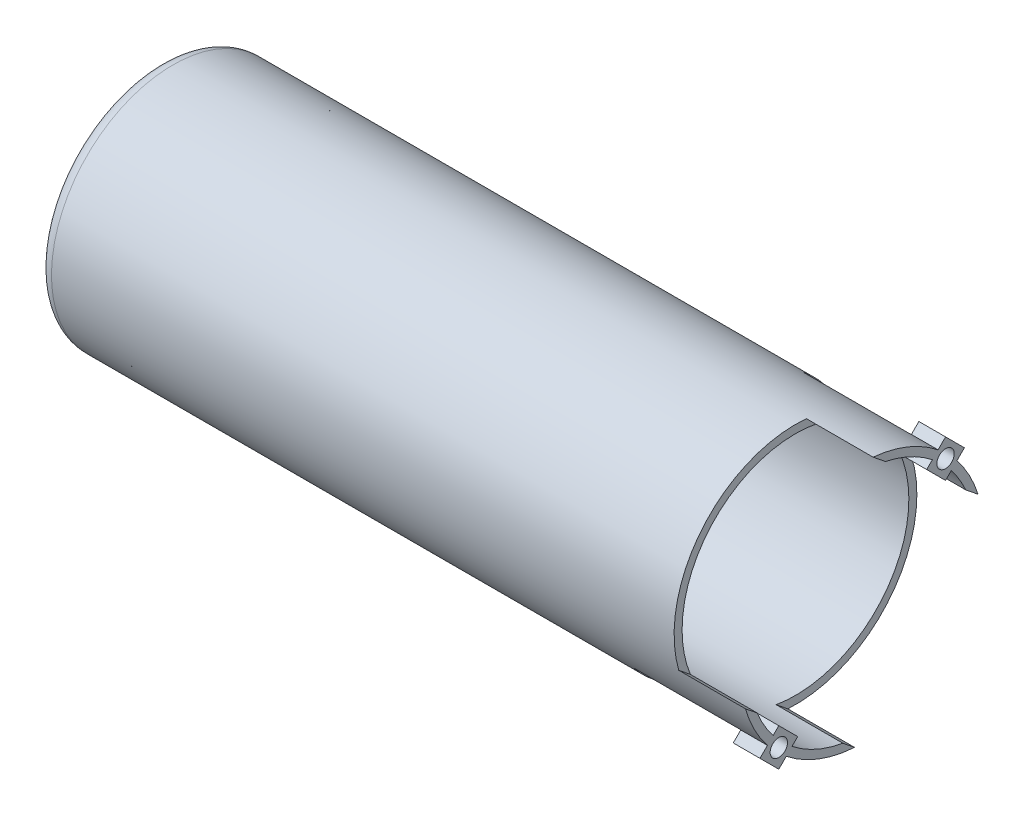
ISO-10303-21;
HEADER;
FILE_DESCRIPTION(('STEP AP214'),'2;1');
FILE_NAME('part.step','',(''),(''),'','','');
FILE_SCHEMA(('AUTOMOTIVE_DESIGN { 1 0 10303 214 1 1 1 1 }'));
ENDSEC;
DATA;
#1=APPLICATION_CONTEXT('core data for automotive mechanical design processes');
#2=APPLICATION_PROTOCOL_DEFINITION('international standard','automotive_design',2000,#1);
#3=PRODUCT_CONTEXT('',#1,'mechanical');
#4=PRODUCT('Part','Part','',(#3));
#5=PRODUCT_RELATED_PRODUCT_CATEGORY('part','',(#4));
#6=PRODUCT_DEFINITION_FORMATION('','',#4);
#7=PRODUCT_DEFINITION_CONTEXT('part definition',#1,'design');
#8=PRODUCT_DEFINITION('design','',#6,#7);
#9=PRODUCT_DEFINITION_SHAPE('','',#8);
#10=(LENGTH_UNIT() NAMED_UNIT(*) SI_UNIT(.MILLI.,.METRE.));
#11=(NAMED_UNIT(*) PLANE_ANGLE_UNIT() SI_UNIT($,.RADIAN.));
#12=(NAMED_UNIT(*) SI_UNIT($,.STERADIAN.) SOLID_ANGLE_UNIT());
#13=UNCERTAINTY_MEASURE_WITH_UNIT(LENGTH_MEASURE(1.E-05),#10,'distance_accuracy_value','');
#14=(GEOMETRIC_REPRESENTATION_CONTEXT(3) GLOBAL_UNCERTAINTY_ASSIGNED_CONTEXT((#13)) GLOBAL_UNIT_ASSIGNED_CONTEXT((#10,
#11,#12)) REPRESENTATION_CONTEXT('',''));
#15=CARTESIAN_POINT('',(0.,0.,0.));
#16=DIRECTION('',(0.,0.,1.));
#17=DIRECTION('',(1.,0.,0.));
#18=AXIS2_PLACEMENT_3D('',#15,#16,#17);
#19=CARTESIAN_POINT('',(-18.9272831798289,4.5526042800529,0.));
#20=DIRECTION('',(-1.,0.,0.));
#21=DIRECTION('',(0.,0.,1.));
#22=AXIS2_PLACEMENT_3D('',#19,#20,#21);
#23=CYLINDRICAL_SURFACE('',#22,8.5);
#24=CARTESIAN_POINT('',(-17.3259221439765,4.5526042800529,0.));
#25=DIRECTION('',(-1.,0.,0.));
#26=DIRECTION('',(0.,0.,1.));
#27=AXIS2_PLACEMENT_3D('',#24,#25,#26);
#28=CIRCLE('',#27,8.5);
#29=CARTESIAN_POINT('',(-17.3259221439765,4.5526042800529,8.5));
#30=VERTEX_POINT('',#29);
#31=EDGE_CURVE('E403',#30,#30,#28,.T.);
#32=ORIENTED_EDGE('',*,*,#31,.T.);
#33=EDGE_LOOP('',(#32));
#34=FACE_BOUND('',#33,.T.);
#35=DIRECTION('',(1.,0.,0.));
#36=VECTOR('',#35,1.);
#37=CARTESIAN_POINT('',(28.6740778560235,-2.13834676743719,5.2422489525099));
#38=LINE('',#37,#36);
#39=CARTESIAN_POINT('',(24.6740778560235,-2.13834676743719,5.2422489525099));
#40=VERTEX_POINT('',#39);
#41=CARTESIAN_POINT('',(32.6740778560235,-2.13834676743719,5.2422489525099));
#42=VERTEX_POINT('',#41);
#43=EDGE_CURVE('E272',#40,#42,#38,.T.);
#44=ORIENTED_EDGE('',*,*,#43,.T.);
#45=CARTESIAN_POINT('',(32.6740778560235,4.5526042800529,0.));
#46=DIRECTION('',(-1.,0.,0.));
#47=DIRECTION('',(0.,0.,1.));
#48=AXIS2_PLACEMENT_3D('',#45,#46,#47);
#49=CIRCLE('',#48,8.5);
#50=CARTESIAN_POINT('',(32.6740778560235,-2.12317069429031,5.26156141197011));
#51=VERTEX_POINT('',#50);
#52=EDGE_CURVE('E500',#42,#51,#49,.T.);
#53=ORIENTED_EDGE('',*,*,#52,.T.);
#54=DIRECTION('',(-1.,0.,0.));
#55=VECTOR('',#54,1.);
#56=CARTESIAN_POINT('',(-18.9272831798289,-2.12317069429031,5.26156141197011));
#57=LINE('',#56,#55);
#58=CARTESIAN_POINT('',(34.6740778560235,-2.12317069429031,5.26156141197011));
#59=VERTEX_POINT('',#58);
#60=EDGE_CURVE('E353',#59,#51,#57,.T.);
#61=ORIENTED_EDGE('',*,*,#60,.F.);
#62=CARTESIAN_POINT('',(34.6740778560235,4.5526042800529,0.));
#63=DIRECTION('',(-1.,0.,0.));
#64=DIRECTION('',(0.,0.,1.));
#65=AXIS2_PLACEMENT_3D('',#62,#63,#64);
#66=CIRCLE('',#65,8.5);
#67=CARTESIAN_POINT('',(34.6740778560235,-3.82289373435972,1.44949405330625));
#68=VERTEX_POINT('',#67);
#69=EDGE_CURVE('E405',#68,#59,#66,.T.);
#70=ORIENTED_EDGE('',*,*,#69,.F.);
#71=DIRECTION('',(-1.,0.,0.));
#72=VECTOR('',#71,1.);
#73=CARTESIAN_POINT('',(-18.9272831798289,-3.82289373435972,1.44949405330625));
#74=LINE('',#73,#72);
#75=CARTESIAN_POINT('',(29.6740778560235,-3.82289373435972,1.44949405330625));
#76=VERTEX_POINT('',#75);
#77=EDGE_CURVE('E381',#76,#68,#74,.F.);
#78=ORIENTED_EDGE('',*,*,#77,.F.);
#79=CARTESIAN_POINT('',(29.6740778560235,4.5526042800529,0.));
#80=DIRECTION('',(-1.,0.,0.));
#81=DIRECTION('',(0.,0.,1.));
#82=AXIS2_PLACEMENT_3D('',#79,#80,#81);
#83=CIRCLE('',#82,8.5);
#84=CARTESIAN_POINT('',(29.6740778560235,8.01924405990329,-7.76095410608508));
#85=VERTEX_POINT('',#84);
#86=EDGE_CURVE('E380',#85,#76,#83,.T.);
#87=ORIENTED_EDGE('',*,*,#86,.F.);
#88=DIRECTION('',(-1.,0.,0.));
#89=VECTOR('',#88,1.);
#90=CARTESIAN_POINT('',(-18.9272831798289,8.01924405990329,-7.76095410608508));
#91=LINE('',#90,#89);
#92=CARTESIAN_POINT('',(34.6740778560235,8.01924405990329,-7.76095410608508));
#93=VERTEX_POINT('',#92);
#94=EDGE_CURVE('E387',#93,#85,#91,.T.);
#95=ORIENTED_EDGE('',*,*,#94,.F.);
#96=CARTESIAN_POINT('',(34.6740778560235,9.81416569202302,-6.67577497434321));
#97=VERTEX_POINT('',#96);
#98=EDGE_CURVE('E404',#97,#93,#66,.T.);
#99=ORIENTED_EDGE('',*,*,#98,.F.);
#100=DIRECTION('',(-1.,0.,0.));
#101=VECTOR('',#100,1.);
#102=CARTESIAN_POINT('',(-18.9272831798289,9.81416569202302,-6.67577497434321));
#103=LINE('',#102,#101);
#104=CARTESIAN_POINT('',(32.6740778560235,9.81416569202302,-6.67577497434321));
#105=VERTEX_POINT('',#104);
#106=EDGE_CURVE('E317',#105,#97,#103,.F.);
#107=ORIENTED_EDGE('',*,*,#106,.F.);
#108=CARTESIAN_POINT('',(32.6740778560235,4.5526042800529,0.));
#109=DIRECTION('',(-1.,0.,0.));
#110=DIRECTION('',(0.,0.,1.));
#111=AXIS2_PLACEMENT_3D('',#108,#109,#110);
#112=CIRCLE('',#111,8.5);
#113=CARTESIAN_POINT('',(32.6740778560235,9.7948532325628,-6.6909510474901));
#114=VERTEX_POINT('',#113);
#115=EDGE_CURVE('E477',#105,#114,#112,.T.);
#116=ORIENTED_EDGE('',*,*,#115,.T.);
#117=DIRECTION('',(1.,0.,0.));
#118=VECTOR('',#117,1.);
#119=CARTESIAN_POINT('',(28.6740778560235,9.7948532325628,-6.6909510474901));
#120=LINE('',#119,#118);
#121=CARTESIAN_POINT('',(24.6740778560235,9.7948532325628,-6.6909510474901));
#122=VERTEX_POINT('',#121);
#123=EDGE_CURVE('E277',#114,#122,#120,.F.);
#124=ORIENTED_EDGE('',*,*,#123,.T.);
#125=CARTESIAN_POINT('',(24.6740778560235,4.5526042800529,0.));
#126=DIRECTION('',(-1.,0.,0.));
#127=DIRECTION('',(0.,0.,1.));
#128=AXIS2_PLACEMENT_3D('',#125,#126,#127);
#129=CIRCLE('',#128,8.5);
#130=CARTESIAN_POINT('',(24.6740778560235,11.243555327543,-5.2422489525099));
#131=VERTEX_POINT('',#130);
#132=EDGE_CURVE('E282',#131,#122,#129,.T.);
#133=ORIENTED_EDGE('',*,*,#132,.F.);
#134=DIRECTION('',(1.,0.,0.));
#135=VECTOR('',#134,1.);
#136=CARTESIAN_POINT('',(28.6740778560235,11.243555327543,-5.2422489525099));
#137=LINE('',#136,#135);
#138=CARTESIAN_POINT('',(32.6740778560235,11.243555327543,-5.2422489525099));
#139=VERTEX_POINT('',#138);
#140=EDGE_CURVE('E468',#131,#139,#137,.T.);
#141=ORIENTED_EDGE('',*,*,#140,.T.);
#142=CARTESIAN_POINT('',(32.6740778560235,11.2283792543961,-5.26156141197012));
#143=VERTEX_POINT('',#142);
#144=EDGE_CURVE('E474',#139,#143,#112,.T.);
#145=ORIENTED_EDGE('',*,*,#144,.T.);
#146=DIRECTION('',(-1.,0.,0.));
#147=VECTOR('',#146,1.);
#148=CARTESIAN_POINT('',(-18.9272831798289,11.2283792543961,-5.26156141197012));
#149=LINE('',#148,#147);
#150=CARTESIAN_POINT('',(34.6740778560235,11.2283792543961,-5.26156141197012));
#151=VERTEX_POINT('',#150);
#152=EDGE_CURVE('E325',#151,#143,#149,.T.);
#153=ORIENTED_EDGE('',*,*,#152,.F.);
#154=CARTESIAN_POINT('',(34.6740778560235,12.8724002638924,-1.74097524028583));
#155=VERTEX_POINT('',#154);
#156=EDGE_CURVE('E400',#155,#151,#66,.T.);
#157=ORIENTED_EDGE('',*,*,#156,.F.);
#158=DIRECTION('',(-1.,0.,0.));
#159=VECTOR('',#158,1.);
#160=CARTESIAN_POINT('',(-18.9272831798289,12.8724002638924,-1.74097524028583));
#161=LINE('',#160,#159);
#162=CARTESIAN_POINT('',(29.6740778560235,12.8724002638924,-1.74097524028584));
#163=VERTEX_POINT('',#162);
#164=EDGE_CURVE('E385',#163,#155,#161,.F.);
#165=ORIENTED_EDGE('',*,*,#164,.F.);
#166=CARTESIAN_POINT('',(29.6740778560235,1.35898981127796,7.8772347067249));
#167=VERTEX_POINT('',#166);
#168=EDGE_CURVE('E378',#167,#163,#83,.T.);
#169=ORIENTED_EDGE('',*,*,#168,.F.);
#170=DIRECTION('',(-1.,0.,0.));
#171=VECTOR('',#170,1.);
#172=CARTESIAN_POINT('',(-18.9272831798289,1.35898981127796,7.8772347067249));
#173=LINE('',#172,#171);
#174=CARTESIAN_POINT('',(34.6740778560235,1.35898981127796,7.8772347067249));
#175=VERTEX_POINT('',#174);
#176=EDGE_CURVE('E383',#175,#167,#173,.T.);
#177=ORIENTED_EDGE('',*,*,#176,.F.);
#178=CARTESIAN_POINT('',(34.6740778560235,-0.708957131917212,6.67577497434321));
#179=VERTEX_POINT('',#178);
#180=EDGE_CURVE('E397',#179,#175,#66,.T.);
#181=ORIENTED_EDGE('',*,*,#180,.F.);
#182=DIRECTION('',(-1.,0.,0.));
#183=VECTOR('',#182,1.);
#184=CARTESIAN_POINT('',(-18.9272831798289,-0.708957131917212,6.67577497434321));
#185=LINE('',#184,#183);
#186=CARTESIAN_POINT('',(32.6740778560235,-0.708957131917212,6.67577497434321));
#187=VERTEX_POINT('',#186);
#188=EDGE_CURVE('E363',#187,#179,#185,.F.);
#189=ORIENTED_EDGE('',*,*,#188,.F.);
#190=CARTESIAN_POINT('',(32.6740778560235,-0.689644672457003,6.6909510474901));
#191=VERTEX_POINT('',#190);
#192=EDGE_CURVE('E499',#187,#191,#49,.T.);
#193=ORIENTED_EDGE('',*,*,#192,.T.);
#194=DIRECTION('',(1.,0.,0.));
#195=VECTOR('',#194,1.);
#196=CARTESIAN_POINT('',(28.6740778560235,-0.689644672457003,6.6909510474901));
#197=LINE('',#196,#195);
#198=CARTESIAN_POINT('',(24.6740778560235,-0.689644672457003,6.6909510474901));
#199=VERTEX_POINT('',#198);
#200=EDGE_CURVE('E265',#191,#199,#197,.F.);
#201=ORIENTED_EDGE('',*,*,#200,.T.);
#202=CARTESIAN_POINT('',(24.6740778560235,4.5526042800529,0.));
#203=DIRECTION('',(-1.,0.,0.));
#204=DIRECTION('',(0.,0.,1.));
#205=AXIS2_PLACEMENT_3D('',#202,#203,#204);
#206=CIRCLE('',#205,8.5);
#207=EDGE_CURVE('E284',#40,#199,#206,.T.);
#208=ORIENTED_EDGE('',*,*,#207,.F.);
#209=EDGE_LOOP('',(#44,#53,#61,#70,#78,#87,#95,#99,#107,#116,#124,#133,#141,#145,#153,#157,#165,
#169,#177,#181,#189,#193,#201,#208));
#210=FACE_BOUND('',#209,.T.);
#211=ADVANCED_FACE('F33',(#34,#210),#23,.F.);
#212=CARTESIAN_POINT('',(-18.9272831798289,4.5526042800529,0.));
#213=DIRECTION('',(-1.,0.,0.));
#214=DIRECTION('',(0.,0.,1.));
#215=AXIS2_PLACEMENT_3D('',#212,#213,#214);
#216=CYLINDRICAL_SURFACE('',#215,9.1);
#217=CARTESIAN_POINT('',(-17.0028296264967,4.5526042800529,0.));
#218=DIRECTION('',(1.,0.,0.));
#219=DIRECTION('',(0.,0.,-1.));
#220=AXIS2_PLACEMENT_3D('',#217,#218,#219);
#221=CIRCLE('',#220,9.1);
#222=CARTESIAN_POINT('',(-17.0028296264967,4.5526042800529,-9.1));
#223=VERTEX_POINT('',#222);
#224=EDGE_CURVE('E414',#223,#223,#221,.T.);
#225=ORIENTED_EDGE('',*,*,#224,.T.);
#226=EDGE_LOOP('',(#225));
#227=FACE_BOUND('',#226,.T.);
#228=DIRECTION('',(1.,0.,0.));
#229=VECTOR('',#228,1.);
#230=CARTESIAN_POINT('',(28.6740778560235,-1.0710990454476,7.15429667449951));
#231=LINE('',#230,#229);
#232=CARTESIAN_POINT('',(24.6740778560235,-1.0710990454476,7.1542966744995));
#233=VERTEX_POINT('',#232);
#234=CARTESIAN_POINT('',(32.6740778560235,-1.0710990454476,7.1542966744995));
#235=VERTEX_POINT('',#234);
#236=EDGE_CURVE('E262',#233,#235,#231,.T.);
#237=ORIENTED_EDGE('',*,*,#236,.T.);
#238=CARTESIAN_POINT('',(32.6740778560235,4.5526042800529,0.));
#239=DIRECTION('',(-1.,0.,0.));
#240=DIRECTION('',(0.,0.,1.));
#241=AXIS2_PLACEMENT_3D('',#238,#239,#240);
#242=CIRCLE('',#241,9.1);
#243=CARTESIAN_POINT('',(32.6740778560235,-1.13599062035891,7.1028084627849));
#244=VERTEX_POINT('',#243);
#245=EDGE_CURVE('E244',#235,#244,#242,.F.);
#246=ORIENTED_EDGE('',*,*,#245,.T.);
#247=DIRECTION('',(-1.,0.,0.));
#248=VECTOR('',#247,1.);
#249=CARTESIAN_POINT('',(-18.9272831798289,-1.13599062035891,7.1028084627849));
#250=LINE('',#249,#248);
#251=CARTESIAN_POINT('',(34.6740778560235,-1.13599062035891,7.1028084627849));
#252=VERTEX_POINT('',#251);
#253=EDGE_CURVE('E438',#252,#244,#250,.T.);
#254=ORIENTED_EDGE('',*,*,#253,.F.);
#255=CARTESIAN_POINT('',(34.6740778560235,4.5526042800529,0.));
#256=DIRECTION('',(-1.,0.,0.));
#257=DIRECTION('',(0.,0.,1.));
#258=AXIS2_PLACEMENT_3D('',#255,#256,#257);
#259=CIRCLE('',#258,9.1);
#260=CARTESIAN_POINT('',(34.6740778560235,2.06541993623381,8.75350867023397));
#261=VERTEX_POINT('',#260);
#262=EDGE_CURVE('E420',#252,#261,#259,.T.);
#263=ORIENTED_EDGE('',*,*,#262,.T.);
#264=DIRECTION('',(-1.,0.,0.));
#265=VECTOR('',#264,1.);
#266=CARTESIAN_POINT('',(-18.9272831798289,2.06541993623381,8.75350867023397));
#267=LINE('',#266,#265);
#268=CARTESIAN_POINT('',(29.6740778560235,2.06541993623381,8.75350867023397));
#269=VERTEX_POINT('',#268);
#270=EDGE_CURVE('E422',#269,#261,#267,.F.);
#271=ORIENTED_EDGE('',*,*,#270,.F.);
#272=CARTESIAN_POINT('',(29.6740778560235,4.5526042800529,0.));
#273=DIRECTION('',(-1.,0.,0.));
#274=DIRECTION('',(0.,0.,1.));
#275=AXIS2_PLACEMENT_3D('',#272,#273,#274);
#276=CIRCLE('',#275,9.1);
#277=CARTESIAN_POINT('',(29.6740778560235,13.6156744371902,-0.818998978514305));
#278=VERTEX_POINT('',#277);
#279=EDGE_CURVE('E417',#278,#269,#276,.F.);
#280=ORIENTED_EDGE('',*,*,#279,.F.);
#281=DIRECTION('',(-1.,0.,0.));
#282=VECTOR('',#281,1.);
#283=CARTESIAN_POINT('',(-18.9272831798289,13.6156744371902,-0.818998978514303));
#284=LINE('',#283,#282);
#285=CARTESIAN_POINT('',(34.6740778560235,13.6156744371902,-0.818998978514305));
#286=VERTEX_POINT('',#285);
#287=EDGE_CURVE('E426',#286,#278,#284,.T.);
#288=ORIENTED_EDGE('',*,*,#287,.F.);
#289=CARTESIAN_POINT('',(34.6740778560235,11.6554127428378,-5.68859490041181));
#290=VERTEX_POINT('',#289);
#291=EDGE_CURVE('E56',#286,#290,#259,.T.);
#292=ORIENTED_EDGE('',*,*,#291,.T.);
#293=DIRECTION('',(-1.,0.,0.));
#294=VECTOR('',#293,1.);
#295=CARTESIAN_POINT('',(-18.9272831798289,11.6554127428378,-5.68859490041181));
#296=LINE('',#295,#294);
#297=CARTESIAN_POINT('',(32.6740778560235,11.6554127428378,-5.68859490041181));
#298=VERTEX_POINT('',#297);
#299=EDGE_CURVE('E443',#298,#290,#296,.F.);
#300=ORIENTED_EDGE('',*,*,#299,.F.);
#301=CARTESIAN_POINT('',(32.6740778560235,4.5526042800529,0.));
#302=DIRECTION('',(-1.,0.,0.));
#303=DIRECTION('',(0.,0.,1.));
#304=AXIS2_PLACEMENT_3D('',#301,#302,#303);
#305=CIRCLE('',#304,9.1);
#306=CARTESIAN_POINT('',(32.6740778560235,11.7069009545524,-5.6237033255005));
#307=VERTEX_POINT('',#306);
#308=EDGE_CURVE('E472',#298,#307,#305,.F.);
#309=ORIENTED_EDGE('',*,*,#308,.T.);
#310=DIRECTION('',(1.,0.,0.));
#311=VECTOR('',#310,1.);
#312=CARTESIAN_POINT('',(28.6740778560235,11.7069009545524,-5.6237033255005));
#313=LINE('',#312,#311);
#314=CARTESIAN_POINT('',(24.6740778560235,11.7069009545524,-5.6237033255005));
#315=VERTEX_POINT('',#314);
#316=EDGE_CURVE('E465',#307,#315,#313,.F.);
#317=ORIENTED_EDGE('',*,*,#316,.T.);
#318=CARTESIAN_POINT('',(24.6740778560235,4.5526042800529,0.));
#319=DIRECTION('',(-1.,0.,0.));
#320=DIRECTION('',(0.,0.,1.));
#321=AXIS2_PLACEMENT_3D('',#318,#319,#320);
#322=CIRCLE('',#321,9.1);
#323=CARTESIAN_POINT('',(24.6740778560235,10.1763076055534,-7.15429667449951));
#324=VERTEX_POINT('',#323);
#325=EDGE_CURVE('E41',#324,#315,#322,.F.);
#326=ORIENTED_EDGE('',*,*,#325,.F.);
#327=DIRECTION('',(1.,0.,0.));
#328=VECTOR('',#327,1.);
#329=CARTESIAN_POINT('',(28.6740778560235,10.1763076055534,-7.15429667449951));
#330=LINE('',#329,#328);
#331=CARTESIAN_POINT('',(32.6740778560235,10.1763076055534,-7.15429667449951));
#332=VERTEX_POINT('',#331);
#333=EDGE_CURVE('E473',#324,#332,#330,.T.);
#334=ORIENTED_EDGE('',*,*,#333,.T.);
#335=CARTESIAN_POINT('',(32.6740778560235,10.2411991804647,-7.1028084627849));
#336=VERTEX_POINT('',#335);
#337=EDGE_CURVE('E256',#332,#336,#305,.F.);
#338=ORIENTED_EDGE('',*,*,#337,.T.);
#339=DIRECTION('',(-1.,0.,0.));
#340=VECTOR('',#339,1.);
#341=CARTESIAN_POINT('',(-18.9272831798289,10.2411991804647,-7.1028084627849));
#342=LINE('',#341,#340);
#343=CARTESIAN_POINT('',(34.6740778560235,10.2411991804647,-7.1028084627849));
#344=VERTEX_POINT('',#343);
#345=EDGE_CURVE('E440',#344,#336,#342,.T.);
#346=ORIENTED_EDGE('',*,*,#345,.F.);
#347=CARTESIAN_POINT('',(34.6740778560235,7.27596988660549,-8.68293036785661));
#348=VERTEX_POINT('',#347);
#349=EDGE_CURVE('E398',#344,#348,#259,.T.);
#350=ORIENTED_EDGE('',*,*,#349,.T.);
#351=DIRECTION('',(-1.,0.,0.));
#352=VECTOR('',#351,1.);
#353=CARTESIAN_POINT('',(-18.9272831798289,7.27596988660548,-8.68293036785661));
#354=LINE('',#353,#352);
#355=CARTESIAN_POINT('',(29.6740778560235,7.27596988660549,-8.68293036785661));
#356=VERTEX_POINT('',#355);
#357=EDGE_CURVE('E432',#356,#348,#354,.F.);
#358=ORIENTED_EDGE('',*,*,#357,.F.);
#359=CARTESIAN_POINT('',(29.6740778560235,-4.52932385931557,0.57322008979718));
#360=VERTEX_POINT('',#359);
#361=EDGE_CURVE('E423',#360,#356,#276,.F.);
#362=ORIENTED_EDGE('',*,*,#361,.F.);
#363=DIRECTION('',(-1.,0.,0.));
#364=VECTOR('',#363,1.);
#365=CARTESIAN_POINT('',(-18.9272831798289,-4.52932385931558,0.573220089797179));
#366=LINE('',#365,#364);
#367=CARTESIAN_POINT('',(34.6740778560235,-4.52932385931557,0.57322008979718));
#368=VERTEX_POINT('',#367);
#369=EDGE_CURVE('E429',#368,#360,#366,.T.);
#370=ORIENTED_EDGE('',*,*,#369,.F.);
#371=CARTESIAN_POINT('',(34.6740778560235,-2.550204182732,5.68859490041181));
#372=VERTEX_POINT('',#371);
#373=EDGE_CURVE('E399',#368,#372,#259,.T.);
#374=ORIENTED_EDGE('',*,*,#373,.T.);
#375=DIRECTION('',(-1.,0.,0.));
#376=VECTOR('',#375,1.);
#377=CARTESIAN_POINT('',(-18.9272831798289,-2.550204182732,5.68859490041181));
#378=LINE('',#377,#376);
#379=CARTESIAN_POINT('',(32.6740778560235,-2.550204182732,5.68859490041181));
#380=VERTEX_POINT('',#379);
#381=EDGE_CURVE('E435',#380,#372,#378,.F.);
#382=ORIENTED_EDGE('',*,*,#381,.F.);
#383=CARTESIAN_POINT('',(32.6740778560235,-2.60169239444661,5.6237033255005));
#384=VERTEX_POINT('',#383);
#385=EDGE_CURVE('E257',#380,#384,#242,.F.);
#386=ORIENTED_EDGE('',*,*,#385,.T.);
#387=DIRECTION('',(1.,0.,0.));
#388=VECTOR('',#387,1.);
#389=CARTESIAN_POINT('',(28.6740778560235,-2.6016923944466,5.6237033255005));
#390=LINE('',#389,#388);
#391=CARTESIAN_POINT('',(24.6740778560235,-2.60169239444661,5.6237033255005));
#392=VERTEX_POINT('',#391);
#393=EDGE_CURVE('E273',#384,#392,#390,.F.);
#394=ORIENTED_EDGE('',*,*,#393,.T.);
#395=CARTESIAN_POINT('',(24.6740778560235,4.5526042800529,0.));
#396=DIRECTION('',(-1.,0.,0.));
#397=DIRECTION('',(0.,0.,1.));
#398=AXIS2_PLACEMENT_3D('',#395,#396,#397);
#399=CIRCLE('',#398,9.1);
#400=EDGE_CURVE('E11',#233,#392,#399,.F.);
#401=ORIENTED_EDGE('',*,*,#400,.F.);
#402=EDGE_LOOP('',(#237,#246,#254,#263,#271,#280,#288,#292,#300,#309,#317,#326,#334,#338,#346,
#350,#358,#362,#370,#374,#382,#386,#394,#401));
#403=FACE_BOUND('',#402,.T.);
#404=ADVANCED_FACE('F270',(#227,#403),#216,.T.);
#405=CARTESIAN_POINT('',(29.6740778560235,10.8026042800529,-6.25));
#406=DIRECTION('',(1.,0.,0.));
#407=DIRECTION('',(0.,0.,-1.));
#408=AXIS2_PLACEMENT_3D('',#405,#406,#407);
#409=CYLINDRICAL_SURFACE('',#408,0.65);
#410=CARTESIAN_POINT('',(34.6740778560235,10.8026042800529,-6.25));
#411=DIRECTION('',(1.,0.,0.));
#412=DIRECTION('',(0.,0.,-1.));
#413=AXIS2_PLACEMENT_3D('',#410,#411,#412);
#414=CIRCLE('',#413,0.65);
#415=CARTESIAN_POINT('',(34.6740778560235,10.8026042800529,-6.9));
#416=VERTEX_POINT('',#415);
#417=EDGE_CURVE('E287',#416,#416,#414,.T.);
#418=ORIENTED_EDGE('',*,*,#417,.T.);
#419=EDGE_LOOP('',(#418));
#420=FACE_BOUND('',#419,.T.);
#421=CARTESIAN_POINT('',(32.6740778560235,10.8026042800529,-6.25));
#422=DIRECTION('',(-1.,0.,0.));
#423=DIRECTION('',(0.,0.,1.));
#424=AXIS2_PLACEMENT_3D('',#421,#422,#423);
#425=CIRCLE('',#424,0.65);
#426=CARTESIAN_POINT('',(32.6740778560235,10.8026042800529,-5.6));
#427=VERTEX_POINT('',#426);
#428=EDGE_CURVE('E445',#427,#427,#425,.T.);
#429=ORIENTED_EDGE('',*,*,#428,.T.);
#430=EDGE_LOOP('',(#429));
#431=FACE_BOUND('',#430,.T.);
#432=ADVANCED_FACE('F606',(#420,#431),#409,.F.);
#433=CARTESIAN_POINT('',(29.6740778560235,-1.6973957199471,6.25));
#434=DIRECTION('',(1.,0.,0.));
#435=DIRECTION('',(0.,0.,-1.));
#436=AXIS2_PLACEMENT_3D('',#433,#434,#435);
#437=CYLINDRICAL_SURFACE('',#436,0.65);
#438=CARTESIAN_POINT('',(34.6740778560235,-1.6973957199471,6.25));
#439=DIRECTION('',(1.,0.,0.));
#440=DIRECTION('',(0.,0.,-1.));
#441=AXIS2_PLACEMENT_3D('',#438,#439,#440);
#442=CIRCLE('',#441,0.65);
#443=CARTESIAN_POINT('',(34.6740778560235,-1.6973957199471,5.6));
#444=VERTEX_POINT('',#443);
#445=EDGE_CURVE('E286',#444,#444,#442,.T.);
#446=ORIENTED_EDGE('',*,*,#445,.T.);
#447=EDGE_LOOP('',(#446));
#448=FACE_BOUND('',#447,.T.);
#449=CARTESIAN_POINT('',(32.6740778560235,-1.6973957199471,6.25));
#450=DIRECTION('',(-1.,0.,0.));
#451=DIRECTION('',(0.,0.,1.));
#452=AXIS2_PLACEMENT_3D('',#449,#450,#451);
#453=CIRCLE('',#452,0.65);
#454=CARTESIAN_POINT('',(32.6740778560235,-1.6973957199471,6.9));
#455=VERTEX_POINT('',#454);
#456=EDGE_CURVE('E448',#455,#455,#453,.T.);
#457=ORIENTED_EDGE('',*,*,#456,.T.);
#458=EDGE_LOOP('',(#457));
#459=FACE_BOUND('',#458,.T.);
#460=ADVANCED_FACE('F622',(#448,#459),#437,.F.);
#461=CARTESIAN_POINT('',(34.6740778560235,-3.9473957199471,0.));
#462=DIRECTION('',(1.,0.,0.));
#463=DIRECTION('',(0.,0.,-1.));
#464=AXIS2_PLACEMENT_3D('',#461,#462,#463);
#465=PLANE('',#464);
#466=ORIENTED_EDGE('',*,*,#417,.F.);
#467=EDGE_LOOP('',(#466));
#468=FACE_BOUND('',#467,.T.);
#469=ORIENTED_EDGE('',*,*,#349,.F.);
#470=DIRECTION('',(0.,0.707106781186547,-0.707106781186547));
#471=VECTOR('',#470,1.);
#472=CARTESIAN_POINT('',(34.6740778560235,10.8026042800529,-7.6642135623731));
#473=LINE('',#472,#471);
#474=CARTESIAN_POINT('',(34.6740778560235,10.8026042800529,-7.6642135623731));
#475=VERTEX_POINT('',#474);
#476=EDGE_CURVE('E306',#344,#475,#473,.T.);
#477=ORIENTED_EDGE('',*,*,#476,.T.);
#478=DIRECTION('',(0.,0.707106781186547,0.707106781186547));
#479=VECTOR('',#478,1.);
#480=CARTESIAN_POINT('',(34.6740778560235,12.216817842426,-6.25));
#481=LINE('',#480,#479);
#482=CARTESIAN_POINT('',(34.6740778560235,12.216817842426,-6.25));
#483=VERTEX_POINT('',#482);
#484=EDGE_CURVE('E308',#475,#483,#481,.T.);
#485=ORIENTED_EDGE('',*,*,#484,.T.);
#486=DIRECTION('',(0.,-0.707106781186548,0.707106781186547));
#487=VECTOR('',#486,1.);
#488=CARTESIAN_POINT('',(34.6740778560235,10.8026042800529,-4.83578643762691));
#489=LINE('',#488,#487);
#490=EDGE_CURVE('E296',#483,#290,#489,.T.);
#491=ORIENTED_EDGE('',*,*,#490,.T.);
#492=ORIENTED_EDGE('',*,*,#291,.F.);
#493=DIRECTION('',(0.,0.627621936880069,0.778518274895915));
#494=VECTOR('',#493,1.);
#495=CARTESIAN_POINT('',(34.6740778560235,17.672964252085,4.21376689825943));
#496=LINE('',#495,#494);
#497=EDGE_CURVE('E376',#155,#286,#496,.T.);
#498=ORIENTED_EDGE('',*,*,#497,.F.);
#499=ORIENTED_EDGE('',*,*,#156,.T.);
#500=CARTESIAN_POINT('',(34.6740778560235,10.8026042800529,-4.83578643762691));
#501=VERTEX_POINT('',#500);
#502=EDGE_CURVE('E311',#151,#501,#489,.T.);
#503=ORIENTED_EDGE('',*,*,#502,.T.);
#504=DIRECTION('',(0.,-0.707106781186547,-0.707106781186548));
#505=VECTOR('',#504,1.);
#506=CARTESIAN_POINT('',(34.6740778560235,9.38839071767981,-6.25));
#507=LINE('',#506,#505);
#508=CARTESIAN_POINT('',(34.6740778560235,9.38839071767981,-6.25));
#509=VERTEX_POINT('',#508);
#510=EDGE_CURVE('E290',#501,#509,#507,.T.);
#511=ORIENTED_EDGE('',*,*,#510,.T.);
#512=EDGE_CURVE('E48',#509,#97,#473,.T.);
#513=ORIENTED_EDGE('',*,*,#512,.T.);
#514=ORIENTED_EDGE('',*,*,#98,.T.);
#515=EDGE_CURVE('E370',#348,#93,#496,.T.);
#516=ORIENTED_EDGE('',*,*,#515,.F.);
#517=EDGE_LOOP('',(#469,#477,#485,#491,#492,#498,#499,#503,#511,#513,#514,#516));
#518=FACE_BOUND('',#517,.T.);
#519=ADVANCED_FACE('F515',(#468,#518),#465,.T.);
#520=CARTESIAN_POINT('',(-18.9272831798289,4.5526042800529,0.));
#521=DIRECTION('',(-1.,0.,0.));
#522=DIRECTION('',(0.,0.,1.));
#523=AXIS2_PLACEMENT_3D('',#520,#521,#522);
#524=CYLINDRICAL_SURFACE('',#523,4.5);
#525=CARTESIAN_POINT('',(-18.0312300668103,4.5526042800529,0.));
#526=DIRECTION('',(-1.,0.,0.));
#527=DIRECTION('',(0.,0.,1.));
#528=AXIS2_PLACEMENT_3D('',#525,#526,#527);
#529=CIRCLE('',#528,4.5);
#530=CARTESIAN_POINT('',(-18.0312300668103,4.5526042800529,4.5));
#531=VERTEX_POINT('',#530);
#532=EDGE_CURVE('E408',#531,#531,#529,.T.);
#533=ORIENTED_EDGE('',*,*,#532,.F.);
#534=EDGE_LOOP('',(#533));
#535=FACE_BOUND('',#534,.T.);
#536=CARTESIAN_POINT('',(-18.1812300668103,4.5526042800529,0.));
#537=DIRECTION('',(-1.,0.,0.));
#538=DIRECTION('',(0.,0.,1.));
#539=AXIS2_PLACEMENT_3D('',#536,#537,#538);
#540=CIRCLE('',#539,4.5);
#541=CARTESIAN_POINT('',(-18.1812300668103,4.5526042800529,4.5));
#542=VERTEX_POINT('',#541);
#543=EDGE_CURVE('E393',#542,#542,#540,.T.);
#544=ORIENTED_EDGE('',*,*,#543,.T.);
#545=EDGE_LOOP('',(#544));
#546=FACE_BOUND('',#545,.T.);
#547=ADVANCED_FACE('F614',(#535,#546),#524,.F.);
#548=CARTESIAN_POINT('',(-17.0028296264967,4.5526042800529,0.));
#549=DIRECTION('',(1.,0.,0.));
#550=DIRECTION('',(0.,0.,-1.));
#551=AXIS2_PLACEMENT_3D('',#548,#549,#550);
#552=TOROIDAL_SURFACE('',#551,8.1,1.);
#553=CARTESIAN_POINT('',(-17.9841729311793,4.5526042800529,0.));
#554=DIRECTION('',(-1.,0.,0.));
#555=DIRECTION('',(0.,0.,1.));
#556=AXIS2_PLACEMENT_3D('',#553,#554,#555);
#557=CIRCLE('',#556,8.29226366883684);
#558=CARTESIAN_POINT('',(-17.9841729311793,4.5526042800529,8.29226366883684));
#559=VERTEX_POINT('',#558);
#560=EDGE_CURVE('E411',#559,#559,#557,.T.);
#561=ORIENTED_EDGE('',*,*,#560,.F.);
#562=EDGE_LOOP('',(#561));
#563=FACE_BOUND('',#562,.T.);
#564=ORIENTED_EDGE('',*,*,#224,.F.);
#565=EDGE_LOOP('',(#564));
#566=FACE_BOUND('',#565,.T.);
#567=ADVANCED_FACE('F35',(#563,#566),#552,.T.);
#568=CARTESIAN_POINT('',(-17.3259221439765,4.5526042800529,0.));
#569=DIRECTION('',(1.,0.,0.));
#570=DIRECTION('',(0.,0.,-1.));
#571=AXIS2_PLACEMENT_3D('',#568,#569,#570);
#572=CONICAL_SURFACE('',#571,8.5,1.39626340159547);
#573=ORIENTED_EDGE('',*,*,#532,.T.);
#574=EDGE_LOOP('',(#573));
#575=FACE_BOUND('',#574,.T.);
#576=ORIENTED_EDGE('',*,*,#31,.F.);
#577=EDGE_LOOP('',(#576));
#578=FACE_BOUND('',#577,.T.);
#579=ADVANCED_FACE('F611',(#575,#578),#572,.F.);
#580=ORIENTED_EDGE('',*,*,#445,.F.);
#581=EDGE_LOOP('',(#580));
#582=FACE_BOUND('',#581,.T.);
#583=ORIENTED_EDGE('',*,*,#69,.T.);
#584=DIRECTION('',(0.,0.707106781186548,-0.707106781186547));
#585=VECTOR('',#584,1.);
#586=CARTESIAN_POINT('',(34.6740778560235,-1.6973957199471,4.83578643762691));
#587=LINE('',#586,#585);
#588=CARTESIAN_POINT('',(34.6740778560235,-1.6973957199471,4.83578643762691));
#589=VERTEX_POINT('',#588);
#590=EDGE_CURVE('E344',#59,#589,#587,.T.);
#591=ORIENTED_EDGE('',*,*,#590,.T.);
#592=DIRECTION('',(0.,0.707106781186547,0.707106781186548));
#593=VECTOR('',#592,1.);
#594=CARTESIAN_POINT('',(34.6740778560235,-0.283182157574004,6.25));
#595=LINE('',#594,#593);
#596=CARTESIAN_POINT('',(34.6740778560235,-0.283182157574004,6.25));
#597=VERTEX_POINT('',#596);
#598=EDGE_CURVE('E348',#589,#597,#595,.T.);
#599=ORIENTED_EDGE('',*,*,#598,.T.);
#600=DIRECTION('',(0.,-0.707106781186547,0.707106781186548));
#601=VECTOR('',#600,1.);
#602=CARTESIAN_POINT('',(34.6740778560235,-1.6973957199471,7.6642135623731));
#603=LINE('',#602,#601);
#604=EDGE_CURVE('E339',#597,#179,#603,.T.);
#605=ORIENTED_EDGE('',*,*,#604,.T.);
#606=ORIENTED_EDGE('',*,*,#180,.T.);
#607=DIRECTION('',(0.,-0.627621936880069,-0.778518274895915));
#608=VECTOR('',#607,1.);
#609=CARTESIAN_POINT('',(34.6740778560235,5.99519012864625,13.6280959514605));
#610=LINE('',#609,#608);
#611=EDGE_CURVE('E375',#261,#175,#610,.T.);
#612=ORIENTED_EDGE('',*,*,#611,.F.);
#613=ORIENTED_EDGE('',*,*,#262,.F.);
#614=CARTESIAN_POINT('',(34.6740778560235,-1.6973957199471,7.6642135623731));
#615=VERTEX_POINT('',#614);
#616=EDGE_CURVE('E328',#252,#615,#603,.T.);
#617=ORIENTED_EDGE('',*,*,#616,.T.);
#618=DIRECTION('',(0.,-0.707106781186547,-0.707106781186547));
#619=VECTOR('',#618,1.);
#620=CARTESIAN_POINT('',(34.6740778560235,-3.11160928232019,6.25));
#621=LINE('',#620,#619);
#622=CARTESIAN_POINT('',(34.6740778560235,-3.11160928232019,6.25));
#623=VERTEX_POINT('',#622);
#624=EDGE_CURVE('E341',#615,#623,#621,.T.);
#625=ORIENTED_EDGE('',*,*,#624,.T.);
#626=EDGE_CURVE('E345',#623,#372,#587,.T.);
#627=ORIENTED_EDGE('',*,*,#626,.T.);
#628=ORIENTED_EDGE('',*,*,#373,.F.);
#629=EDGE_CURVE('E366',#68,#368,#610,.T.);
#630=ORIENTED_EDGE('',*,*,#629,.F.);
#631=EDGE_LOOP('',(#583,#591,#599,#605,#606,#612,#613,#617,#625,#627,#628,#630));
#632=FACE_BOUND('',#631,.T.);
#633=ADVANCED_FACE('F532',(#582,#632),#465,.T.);
#634=CARTESIAN_POINT('',(-18.5312300668103,4.5526042800529,0.));
#635=DIRECTION('',(1.,0.,0.));
#636=DIRECTION('',(0.,0.,-1.));
#637=AXIS2_PLACEMENT_3D('',#634,#635,#636);
#638=CONICAL_SURFACE('',#637,5.5,1.37732799489928);
#639=ORIENTED_EDGE('',*,*,#560,.T.);
#640=EDGE_LOOP('',(#639));
#641=FACE_BOUND('',#640,.T.);
#642=CARTESIAN_POINT('',(-18.5312300668103,4.5526042800529,0.));
#643=DIRECTION('',(-1.,0.,0.));
#644=DIRECTION('',(0.,0.,1.));
#645=AXIS2_PLACEMENT_3D('',#642,#643,#644);
#646=CIRCLE('',#645,5.5);
#647=CARTESIAN_POINT('',(-18.5312300668103,4.5526042800529,5.5));
#648=VERTEX_POINT('',#647);
#649=EDGE_CURVE('E389',#648,#648,#646,.T.);
#650=ORIENTED_EDGE('',*,*,#649,.F.);
#651=EDGE_LOOP('',(#650));
#652=FACE_BOUND('',#651,.T.);
#653=ADVANCED_FACE('F638',(#641,#652),#638,.T.);
#654=CARTESIAN_POINT('',(-18.1812300668103,4.5526042800529,0.));
#655=DIRECTION('',(-1.,0.,0.));
#656=DIRECTION('',(0.,0.,1.));
#657=AXIS2_PLACEMENT_3D('',#654,#655,#656);
#658=CYLINDRICAL_SURFACE('',#657,5.5);
#659=CARTESIAN_POINT('',(-18.1812300668103,4.5526042800529,0.));
#660=DIRECTION('',(-1.,0.,0.));
#661=DIRECTION('',(0.,0.,1.));
#662=AXIS2_PLACEMENT_3D('',#659,#660,#661);
#663=CIRCLE('',#662,5.5);
#664=CARTESIAN_POINT('',(-18.1812300668103,4.5526042800529,5.5));
#665=VERTEX_POINT('',#664);
#666=EDGE_CURVE('E390',#665,#665,#663,.T.);
#667=ORIENTED_EDGE('',*,*,#666,.F.);
#668=EDGE_LOOP('',(#667));
#669=FACE_BOUND('',#668,.T.);
#670=ORIENTED_EDGE('',*,*,#649,.T.);
#671=EDGE_LOOP('',(#670));
#672=FACE_BOUND('',#671,.T.);
#673=ADVANCED_FACE('F632',(#669,#672),#658,.F.);
#674=CARTESIAN_POINT('',(-18.1812300668103,4.5526042800529,0.));
#675=DIRECTION('',(-1.,0.,0.));
#676=DIRECTION('',(0.,0.,1.));
#677=AXIS2_PLACEMENT_3D('',#674,#675,#676);
#678=PLANE('',#677);
#679=ORIENTED_EDGE('',*,*,#543,.F.);
#680=EDGE_LOOP('',(#679));
#681=FACE_BOUND('',#680,.T.);
#682=ORIENTED_EDGE('',*,*,#666,.T.);
#683=EDGE_LOOP('',(#682));
#684=FACE_BOUND('',#683,.T.);
#685=ADVANCED_FACE('F628',(#681,#684),#678,.T.);
#686=CARTESIAN_POINT('',(29.6740778560235,0.,0.));
#687=DIRECTION('',(-1.,0.,0.));
#688=DIRECTION('',(0.,0.,1.));
#689=AXIS2_PLACEMENT_3D('',#686,#687,#688);
#690=PLANE('',#689);
#691=ORIENTED_EDGE('',*,*,#168,.T.);
#692=DIRECTION('',(0.,0.627621936880069,0.778518274895915));
#693=VECTOR('',#692,1.);
#694=CARTESIAN_POINT('',(29.6740778560235,17.672964252085,4.21376689825943));
#695=LINE('',#694,#693);
#696=EDGE_CURVE('E371',#163,#278,#695,.T.);
#697=ORIENTED_EDGE('',*,*,#696,.T.);
#698=ORIENTED_EDGE('',*,*,#279,.T.);
#699=DIRECTION('',(0.,-0.627621936880069,-0.778518274895915));
#700=VECTOR('',#699,1.);
#701=CARTESIAN_POINT('',(29.6740778560235,5.99519012864625,13.6280959514605));
#702=LINE('',#701,#700);
#703=EDGE_CURVE('E369',#269,#167,#702,.T.);
#704=ORIENTED_EDGE('',*,*,#703,.T.);
#705=EDGE_LOOP('',(#691,#697,#698,#704));
#706=FACE_BOUND('',#705,.T.);
#707=ADVANCED_FACE('F631',(#706),#690,.F.);
#708=CARTESIAN_POINT('',(29.6740778560235,5.99519012864625,13.6280959514605));
#709=DIRECTION('',(0.,-0.778518274895915,0.627621936880069));
#710=DIRECTION('',(0.,-0.627621936880069,-0.778518274895915));
#711=AXIS2_PLACEMENT_3D('',#708,#709,#710);
#712=PLANE('',#711);
#713=ORIENTED_EDGE('',*,*,#176,.T.);
#714=ORIENTED_EDGE('',*,*,#703,.F.);
#715=ORIENTED_EDGE('',*,*,#270,.T.);
#716=ORIENTED_EDGE('',*,*,#611,.T.);
#717=EDGE_LOOP('',(#713,#714,#715,#716));
#718=FACE_BOUND('',#717,.T.);
#719=ADVANCED_FACE('F528',(#718),#712,.F.);
#720=CARTESIAN_POINT('',(29.6740778560235,17.672964252085,4.21376689825943));
#721=DIRECTION('',(0.,0.778518274895915,-0.627621936880069));
#722=DIRECTION('',(0.,0.627621936880069,0.778518274895915));
#723=AXIS2_PLACEMENT_3D('',#720,#721,#722);
#724=PLANE('',#723);
#725=ORIENTED_EDGE('',*,*,#164,.T.);
#726=ORIENTED_EDGE('',*,*,#497,.T.);
#727=ORIENTED_EDGE('',*,*,#287,.T.);
#728=ORIENTED_EDGE('',*,*,#696,.F.);
#729=EDGE_LOOP('',(#725,#726,#727,#728));
#730=FACE_BOUND('',#729,.T.);
#731=ADVANCED_FACE('F652',(#730),#724,.F.);
#732=ORIENTED_EDGE('',*,*,#94,.T.);
#733=EDGE_CURVE('E373',#356,#85,#695,.T.);
#734=ORIENTED_EDGE('',*,*,#733,.F.);
#735=ORIENTED_EDGE('',*,*,#357,.T.);
#736=ORIENTED_EDGE('',*,*,#515,.T.);
#737=EDGE_LOOP('',(#732,#734,#735,#736));
#738=FACE_BOUND('',#737,.T.);
#739=ADVANCED_FACE('F539',(#738),#724,.F.);
#740=ORIENTED_EDGE('',*,*,#86,.T.);
#741=EDGE_CURVE('E367',#76,#360,#702,.T.);
#742=ORIENTED_EDGE('',*,*,#741,.T.);
#743=ORIENTED_EDGE('',*,*,#361,.T.);
#744=ORIENTED_EDGE('',*,*,#733,.T.);
#745=EDGE_LOOP('',(#740,#742,#743,#744));
#746=FACE_BOUND('',#745,.T.);
#747=ADVANCED_FACE('F547',(#746),#690,.F.);
#748=ORIENTED_EDGE('',*,*,#77,.T.);
#749=ORIENTED_EDGE('',*,*,#629,.T.);
#750=ORIENTED_EDGE('',*,*,#369,.T.);
#751=ORIENTED_EDGE('',*,*,#741,.F.);
#752=EDGE_LOOP('',(#748,#749,#750,#751));
#753=FACE_BOUND('',#752,.T.);
#754=ADVANCED_FACE('F549',(#753),#712,.F.);
#755=CARTESIAN_POINT('',(32.6740778560235,-3.11160928232019,6.25));
#756=DIRECTION('',(0.,-0.707106781186547,0.707106781186547));
#757=DIRECTION('',(0.,-0.707106781186548,-0.707106781186548));
#758=AXIS2_PLACEMENT_3D('',#755,#756,#757);
#759=PLANE('',#758);
#760=ORIENTED_EDGE('',*,*,#624,.F.);
#761=DIRECTION('',(1.,0.,0.));
#762=VECTOR('',#761,1.);
#763=CARTESIAN_POINT('',(32.6740778560235,-1.6973957199471,7.6642135623731));
#764=LINE('',#763,#762);
#765=CARTESIAN_POINT('',(32.6740778560235,-1.6973957199471,7.6642135623731));
#766=VERTEX_POINT('',#765);
#767=EDGE_CURVE('E338',#766,#615,#764,.T.);
#768=ORIENTED_EDGE('',*,*,#767,.F.);
#769=DIRECTION('',(0.,-0.707106781186547,-0.707106781186547));
#770=VECTOR('',#769,1.);
#771=CARTESIAN_POINT('',(32.6740778560235,-3.11160928232019,6.25));
#772=LINE('',#771,#770);
#773=CARTESIAN_POINT('',(32.6740778560235,-3.11160928232019,6.25));
#774=VERTEX_POINT('',#773);
#775=EDGE_CURVE('E331',#766,#774,#772,.T.);
#776=ORIENTED_EDGE('',*,*,#775,.T.);
#777=DIRECTION('',(1.,0.,0.));
#778=VECTOR('',#777,1.);
#779=CARTESIAN_POINT('',(32.6740778560235,-3.11160928232019,6.25));
#780=LINE('',#779,#778);
#781=EDGE_CURVE('E357',#774,#623,#780,.T.);
#782=ORIENTED_EDGE('',*,*,#781,.T.);
#783=EDGE_LOOP('',(#760,#768,#776,#782));
#784=FACE_BOUND('',#783,.T.);
#785=ADVANCED_FACE('F599',(#784),#759,.T.);
#786=CARTESIAN_POINT('',(32.6740778560235,-1.6973957199471,4.83578643762691));
#787=DIRECTION('',(0.,-0.707106781186547,-0.707106781186548));
#788=DIRECTION('',(0.,0.707106781186548,-0.707106781186547));
#789=AXIS2_PLACEMENT_3D('',#786,#787,#788);
#790=PLANE('',#789);
#791=DIRECTION('',(0.,0.707106781186548,-0.707106781186547));
#792=VECTOR('',#791,1.);
#793=CARTESIAN_POINT('',(32.6740778560235,-1.6973957199471,4.83578643762691));
#794=LINE('',#793,#792);
#795=EDGE_CURVE('E334',#774,#380,#794,.T.);
#796=ORIENTED_EDGE('',*,*,#795,.T.);
#797=ORIENTED_EDGE('',*,*,#381,.T.);
#798=ORIENTED_EDGE('',*,*,#626,.F.);
#799=ORIENTED_EDGE('',*,*,#781,.F.);
#800=EDGE_LOOP('',(#796,#797,#798,#799));
#801=FACE_BOUND('',#800,.T.);
#802=ADVANCED_FACE('F559',(#801),#790,.T.);
#803=CARTESIAN_POINT('',(32.6740778560235,-1.6973957199471,7.6642135623731));
#804=DIRECTION('',(0.,0.707106781186548,0.707106781186547));
#805=DIRECTION('',(0.,-0.707106781186547,0.707106781186548));
#806=AXIS2_PLACEMENT_3D('',#803,#804,#805);
#807=PLANE('',#806);
#808=ORIENTED_EDGE('',*,*,#616,.F.);
#809=ORIENTED_EDGE('',*,*,#253,.T.);
#810=DIRECTION('',(0.,-0.707106781186547,0.707106781186548));
#811=VECTOR('',#810,1.);
#812=CARTESIAN_POINT('',(32.6740778560235,-1.6973957199471,7.6642135623731));
#813=LINE('',#812,#811);
#814=EDGE_CURVE('E252',#244,#766,#813,.T.);
#815=ORIENTED_EDGE('',*,*,#814,.T.);
#816=ORIENTED_EDGE('',*,*,#767,.T.);
#817=EDGE_LOOP('',(#808,#809,#815,#816));
#818=FACE_BOUND('',#817,.T.);
#819=ADVANCED_FACE('F594',(#818),#807,.T.);
#820=CARTESIAN_POINT('',(32.6740778560235,-0.283182157574004,6.25));
#821=VERTEX_POINT('',#820);
#822=EDGE_CURVE('E329',#821,#187,#813,.T.);
#823=ORIENTED_EDGE('',*,*,#822,.T.);
#824=ORIENTED_EDGE('',*,*,#188,.T.);
#825=ORIENTED_EDGE('',*,*,#604,.F.);
#826=DIRECTION('',(1.,0.,0.));
#827=VECTOR('',#826,1.);
#828=CARTESIAN_POINT('',(32.6740778560235,-0.283182157574004,6.25));
#829=LINE('',#828,#827);
#830=EDGE_CURVE('E351',#821,#597,#829,.T.);
#831=ORIENTED_EDGE('',*,*,#830,.F.);
#832=EDGE_LOOP('',(#823,#824,#825,#831));
#833=FACE_BOUND('',#832,.T.);
#834=ADVANCED_FACE('F578',(#833),#807,.T.);
#835=ORIENTED_EDGE('',*,*,#590,.F.);
#836=ORIENTED_EDGE('',*,*,#60,.T.);
#837=CARTESIAN_POINT('',(32.6740778560235,-1.6973957199471,4.83578643762691));
#838=VERTEX_POINT('',#837);
#839=EDGE_CURVE('E333',#51,#838,#794,.T.);
#840=ORIENTED_EDGE('',*,*,#839,.T.);
#841=DIRECTION('',(1.,0.,0.));
#842=VECTOR('',#841,1.);
#843=CARTESIAN_POINT('',(32.6740778560235,-1.6973957199471,4.83578643762691));
#844=LINE('',#843,#842);
#845=EDGE_CURVE('E354',#838,#589,#844,.T.);
#846=ORIENTED_EDGE('',*,*,#845,.T.);
#847=EDGE_LOOP('',(#835,#836,#840,#846));
#848=FACE_BOUND('',#847,.T.);
#849=ADVANCED_FACE('F584',(#848),#790,.T.);
#850=CARTESIAN_POINT('',(32.6740778560235,0.,0.));
#851=DIRECTION('',(-1.,0.,0.));
#852=DIRECTION('',(0.,0.,1.));
#853=AXIS2_PLACEMENT_3D('',#850,#851,#852);
#854=PLANE('',#853);
#855=ORIENTED_EDGE('',*,*,#456,.F.);
#856=EDGE_LOOP('',(#855));
#857=FACE_BOUND('',#856,.T.);
#858=ORIENTED_EDGE('',*,*,#822,.F.);
#859=DIRECTION('',(0.,0.707106781186547,0.707106781186548));
#860=VECTOR('',#859,1.);
#861=CARTESIAN_POINT('',(32.6740778560235,-0.283182157574004,6.25));
#862=LINE('',#861,#860);
#863=EDGE_CURVE('E336',#838,#821,#862,.T.);
#864=ORIENTED_EDGE('',*,*,#863,.F.);
#865=ORIENTED_EDGE('',*,*,#839,.F.);
#866=ORIENTED_EDGE('',*,*,#52,.F.);
#867=CARTESIAN_POINT('',(32.6740778560235,-1.6973957199471,6.25));
#868=DIRECTION('',(-1.,0.,0.));
#869=DIRECTION('',(0.,0.,1.));
#870=AXIS2_PLACEMENT_3D('',#867,#868,#869);
#871=CIRCLE('',#870,1.1);
#872=EDGE_CURVE('E267',#42,#384,#871,.T.);
#873=ORIENTED_EDGE('',*,*,#872,.T.);
#874=ORIENTED_EDGE('',*,*,#385,.F.);
#875=ORIENTED_EDGE('',*,*,#795,.F.);
#876=ORIENTED_EDGE('',*,*,#775,.F.);
#877=ORIENTED_EDGE('',*,*,#814,.F.);
#878=ORIENTED_EDGE('',*,*,#245,.F.);
#879=EDGE_CURVE('E249',#235,#191,#871,.T.);
#880=ORIENTED_EDGE('',*,*,#879,.T.);
#881=ORIENTED_EDGE('',*,*,#192,.F.);
#882=EDGE_LOOP('',(#858,#864,#865,#866,#873,#874,#875,#876,#877,#878,#880,#881));
#883=FACE_BOUND('',#882,.T.);
#884=ADVANCED_FACE('F247',(#857,#883),#854,.T.);
#885=CARTESIAN_POINT('',(32.6740778560235,-0.283182157574004,6.25));
#886=DIRECTION('',(0.,0.707106781186548,-0.707106781186547));
#887=DIRECTION('',(0.,0.707106781186547,0.707106781186548));
#888=AXIS2_PLACEMENT_3D('',#885,#886,#887);
#889=PLANE('',#888);
#890=ORIENTED_EDGE('',*,*,#598,.F.);
#891=ORIENTED_EDGE('',*,*,#845,.F.);
#892=ORIENTED_EDGE('',*,*,#863,.T.);
#893=ORIENTED_EDGE('',*,*,#830,.T.);
#894=EDGE_LOOP('',(#890,#891,#892,#893));
#895=FACE_BOUND('',#894,.T.);
#896=ADVANCED_FACE('F581',(#895),#889,.T.);
#897=CARTESIAN_POINT('',(32.6740778560235,12.216817842426,-6.25));
#898=DIRECTION('',(0.,0.707106781186547,-0.707106781186547));
#899=DIRECTION('',(0.,0.707106781186548,0.707106781186548));
#900=AXIS2_PLACEMENT_3D('',#897,#898,#899);
#901=PLANE('',#900);
#902=ORIENTED_EDGE('',*,*,#484,.F.);
#903=DIRECTION('',(1.,0.,0.));
#904=VECTOR('',#903,1.);
#905=CARTESIAN_POINT('',(32.6740778560235,10.8026042800529,-7.6642135623731));
#906=LINE('',#905,#904);
#907=CARTESIAN_POINT('',(32.6740778560235,10.8026042800529,-7.6642135623731));
#908=VERTEX_POINT('',#907);
#909=EDGE_CURVE('E320',#908,#475,#906,.T.);
#910=ORIENTED_EDGE('',*,*,#909,.F.);
#911=DIRECTION('',(0.,0.707106781186547,0.707106781186547));
#912=VECTOR('',#911,1.);
#913=CARTESIAN_POINT('',(32.6740778560235,12.216817842426,-6.25));
#914=LINE('',#913,#912);
#915=CARTESIAN_POINT('',(32.6740778560235,12.216817842426,-6.25));
#916=VERTEX_POINT('',#915);
#917=EDGE_CURVE('E299',#908,#916,#914,.T.);
#918=ORIENTED_EDGE('',*,*,#917,.T.);
#919=DIRECTION('',(1.,0.,0.));
#920=VECTOR('',#919,1.);
#921=CARTESIAN_POINT('',(32.6740778560235,12.216817842426,-6.25));
#922=LINE('',#921,#920);
#923=EDGE_CURVE('E318',#916,#483,#922,.T.);
#924=ORIENTED_EDGE('',*,*,#923,.T.);
#925=EDGE_LOOP('',(#902,#910,#918,#924));
#926=FACE_BOUND('',#925,.T.);
#927=ADVANCED_FACE('F511',(#926),#901,.T.);
#928=CARTESIAN_POINT('',(32.6740778560235,10.8026042800529,-7.6642135623731));
#929=DIRECTION('',(0.,-0.707106781186547,-0.707106781186547));
#930=DIRECTION('',(0.,0.707106781186548,-0.707106781186548));
#931=AXIS2_PLACEMENT_3D('',#928,#929,#930);
#932=PLANE('',#931);
#933=ORIENTED_EDGE('',*,*,#476,.F.);
#934=ORIENTED_EDGE('',*,*,#345,.T.);
#935=DIRECTION('',(0.,0.707106781186547,-0.707106781186547));
#936=VECTOR('',#935,1.);
#937=CARTESIAN_POINT('',(32.6740778560235,10.8026042800529,-7.6642135623731));
#938=LINE('',#937,#936);
#939=EDGE_CURVE('E295',#336,#908,#938,.T.);
#940=ORIENTED_EDGE('',*,*,#939,.T.);
#941=ORIENTED_EDGE('',*,*,#909,.T.);
#942=EDGE_LOOP('',(#933,#934,#940,#941));
#943=FACE_BOUND('',#942,.T.);
#944=ADVANCED_FACE('F504',(#943),#932,.T.);
#945=CARTESIAN_POINT('',(32.6740778560235,10.8026042800529,-4.83578643762691));
#946=DIRECTION('',(0.,0.707106781186547,0.707106781186548));
#947=DIRECTION('',(0.,-0.707106781186548,0.707106781186547));
#948=AXIS2_PLACEMENT_3D('',#945,#946,#947);
#949=PLANE('',#948);
#950=DIRECTION('',(0.,-0.707106781186548,0.707106781186547));
#951=VECTOR('',#950,1.);
#952=CARTESIAN_POINT('',(32.6740778560235,10.8026042800529,-4.83578643762691));
#953=LINE('',#952,#951);
#954=EDGE_CURVE('E302',#916,#298,#953,.T.);
#955=ORIENTED_EDGE('',*,*,#954,.T.);
#956=ORIENTED_EDGE('',*,*,#299,.T.);
#957=ORIENTED_EDGE('',*,*,#490,.F.);
#958=ORIENTED_EDGE('',*,*,#923,.F.);
#959=EDGE_LOOP('',(#955,#956,#957,#958));
#960=FACE_BOUND('',#959,.T.);
#961=ADVANCED_FACE('F514',(#960),#949,.T.);
#962=ORIENTED_EDGE('',*,*,#502,.F.);
#963=ORIENTED_EDGE('',*,*,#152,.T.);
#964=CARTESIAN_POINT('',(32.6740778560235,10.8026042800529,-4.83578643762691));
#965=VERTEX_POINT('',#964);
#966=EDGE_CURVE('E301',#143,#965,#953,.T.);
#967=ORIENTED_EDGE('',*,*,#966,.T.);
#968=DIRECTION('',(1.,0.,0.));
#969=VECTOR('',#968,1.);
#970=CARTESIAN_POINT('',(32.6740778560235,10.8026042800529,-4.83578643762691));
#971=LINE('',#970,#969);
#972=EDGE_CURVE('E314',#965,#501,#971,.T.);
#973=ORIENTED_EDGE('',*,*,#972,.T.);
#974=EDGE_LOOP('',(#962,#963,#967,#973));
#975=FACE_BOUND('',#974,.T.);
#976=ADVANCED_FACE('F727',(#975),#949,.T.);
#977=CARTESIAN_POINT('',(32.6740778560235,9.38839071767981,-6.25));
#978=VERTEX_POINT('',#977);
#979=EDGE_CURVE('E297',#978,#105,#938,.T.);
#980=ORIENTED_EDGE('',*,*,#979,.T.);
#981=ORIENTED_EDGE('',*,*,#106,.T.);
#982=ORIENTED_EDGE('',*,*,#512,.F.);
#983=DIRECTION('',(1.,0.,0.));
#984=VECTOR('',#983,1.);
#985=CARTESIAN_POINT('',(32.6740778560235,9.38839071767981,-6.25));
#986=LINE('',#985,#984);
#987=EDGE_CURVE('E304',#978,#509,#986,.T.);
#988=ORIENTED_EDGE('',*,*,#987,.F.);
#989=EDGE_LOOP('',(#980,#981,#982,#988));
#990=FACE_BOUND('',#989,.T.);
#991=ADVANCED_FACE('F719',(#990),#932,.T.);
#992=CARTESIAN_POINT('',(32.6740778560235,0.,0.));
#993=DIRECTION('',(-1.,0.,0.));
#994=DIRECTION('',(0.,0.,1.));
#995=AXIS2_PLACEMENT_3D('',#992,#993,#994);
#996=PLANE('',#995);
#997=ORIENTED_EDGE('',*,*,#428,.F.);
#998=EDGE_LOOP('',(#997));
#999=FACE_BOUND('',#998,.T.);
#1000=DIRECTION('',(0.,-0.707106781186547,-0.707106781186548));
#1001=VECTOR('',#1000,1.);
#1002=CARTESIAN_POINT('',(32.6740778560235,9.38839071767981,-6.25));
#1003=LINE('',#1002,#1001);
#1004=EDGE_CURVE('E293',#965,#978,#1003,.T.);
#1005=ORIENTED_EDGE('',*,*,#1004,.F.);
#1006=ORIENTED_EDGE('',*,*,#966,.F.);
#1007=ORIENTED_EDGE('',*,*,#144,.F.);
#1008=CARTESIAN_POINT('',(32.6740778560235,10.8026042800529,-6.25));
#1009=DIRECTION('',(-1.,0.,0.));
#1010=DIRECTION('',(0.,0.,1.));
#1011=AXIS2_PLACEMENT_3D('',#1008,#1009,#1010);
#1012=CIRCLE('',#1011,1.1);
#1013=EDGE_CURVE('E496',#139,#307,#1012,.T.);
#1014=ORIENTED_EDGE('',*,*,#1013,.T.);
#1015=ORIENTED_EDGE('',*,*,#308,.F.);
#1016=ORIENTED_EDGE('',*,*,#954,.F.);
#1017=ORIENTED_EDGE('',*,*,#917,.F.);
#1018=ORIENTED_EDGE('',*,*,#939,.F.);
#1019=ORIENTED_EDGE('',*,*,#337,.F.);
#1020=EDGE_CURVE('E490',#332,#114,#1012,.T.);
#1021=ORIENTED_EDGE('',*,*,#1020,.T.);
#1022=ORIENTED_EDGE('',*,*,#115,.F.);
#1023=ORIENTED_EDGE('',*,*,#979,.F.);
#1024=EDGE_LOOP('',(#1005,#1006,#1007,#1014,#1015,#1016,#1017,#1018,#1019,#1021,#1022,#1023));
#1025=FACE_BOUND('',#1024,.T.);
#1026=ADVANCED_FACE('F493',(#999,#1025),#996,.T.);
#1027=CARTESIAN_POINT('',(32.6740778560235,9.38839071767981,-6.25));
#1028=DIRECTION('',(0.,-0.707106781186548,0.707106781186547));
#1029=DIRECTION('',(0.,-0.707106781186547,-0.707106781186548));
#1030=AXIS2_PLACEMENT_3D('',#1027,#1028,#1029);
#1031=PLANE('',#1030);
#1032=ORIENTED_EDGE('',*,*,#510,.F.);
#1033=ORIENTED_EDGE('',*,*,#972,.F.);
#1034=ORIENTED_EDGE('',*,*,#1004,.T.);
#1035=ORIENTED_EDGE('',*,*,#987,.T.);
#1036=EDGE_LOOP('',(#1032,#1033,#1034,#1035));
#1037=FACE_BOUND('',#1036,.T.);
#1038=ADVANCED_FACE('F752',(#1037),#1031,.T.);
#1039=CARTESIAN_POINT('',(24.6740778560235,-1.6973957199471,6.25));
#1040=DIRECTION('',(1.,0.,0.));
#1041=DIRECTION('',(0.,0.,-1.));
#1042=AXIS2_PLACEMENT_3D('',#1039,#1040,#1041);
#1043=CYLINDRICAL_SURFACE('',#1042,1.1);
#1044=ORIENTED_EDGE('',*,*,#879,.F.);
#1045=ORIENTED_EDGE('',*,*,#236,.F.);
#1046=CARTESIAN_POINT('',(24.6740778560235,-1.6973957199471,6.25));
#1047=DIRECTION('',(-1.,0.,0.));
#1048=DIRECTION('',(0.,0.,1.));
#1049=AXIS2_PLACEMENT_3D('',#1046,#1047,#1048);
#1050=CIRCLE('',#1049,1.1);
#1051=EDGE_CURVE('E568',#233,#199,#1050,.T.);
#1052=ORIENTED_EDGE('',*,*,#1051,.T.);
#1053=ORIENTED_EDGE('',*,*,#200,.F.);
#1054=EDGE_LOOP('',(#1044,#1045,#1052,#1053));
#1055=FACE_BOUND('',#1054,.T.);
#1056=ADVANCED_FACE('F260',(#1055),#1043,.F.);
#1057=EDGE_CURVE('E266',#40,#392,#1050,.T.);
#1058=ORIENTED_EDGE('',*,*,#1057,.T.);
#1059=ORIENTED_EDGE('',*,*,#393,.F.);
#1060=ORIENTED_EDGE('',*,*,#872,.F.);
#1061=ORIENTED_EDGE('',*,*,#43,.F.);
#1062=EDGE_LOOP('',(#1058,#1059,#1060,#1061));
#1063=FACE_BOUND('',#1062,.T.);
#1064=ADVANCED_FACE('F571',(#1063),#1043,.F.);
#1065=CARTESIAN_POINT('',(24.6740778560235,-1.6973957199471,6.25));
#1066=DIRECTION('',(-1.,0.,0.));
#1067=DIRECTION('',(0.,0.,1.));
#1068=AXIS2_PLACEMENT_3D('',#1065,#1066,#1067);
#1069=PLANE('',#1068);
#1070=ORIENTED_EDGE('',*,*,#207,.T.);
#1071=ORIENTED_EDGE('',*,*,#1051,.F.);
#1072=ORIENTED_EDGE('',*,*,#400,.T.);
#1073=ORIENTED_EDGE('',*,*,#1057,.F.);
#1074=EDGE_LOOP('',(#1070,#1071,#1072,#1073));
#1075=FACE_BOUND('',#1074,.T.);
#1076=ADVANCED_FACE('F574',(#1075),#1069,.F.);
#1077=CARTESIAN_POINT('',(24.6740778560235,10.8026042800529,-6.25));
#1078=DIRECTION('',(1.,0.,0.));
#1079=DIRECTION('',(0.,0.,-1.));
#1080=AXIS2_PLACEMENT_3D('',#1077,#1078,#1079);
#1081=CYLINDRICAL_SURFACE('',#1080,1.1);
#1082=ORIENTED_EDGE('',*,*,#1020,.F.);
#1083=ORIENTED_EDGE('',*,*,#333,.F.);
#1084=CARTESIAN_POINT('',(24.6740778560235,10.8026042800529,-6.25));
#1085=DIRECTION('',(-1.,0.,0.));
#1086=DIRECTION('',(0.,0.,1.));
#1087=AXIS2_PLACEMENT_3D('',#1084,#1085,#1086);
#1088=CIRCLE('',#1087,1.1);
#1089=EDGE_CURVE('E459',#324,#122,#1088,.T.);
#1090=ORIENTED_EDGE('',*,*,#1089,.T.);
#1091=ORIENTED_EDGE('',*,*,#123,.F.);
#1092=EDGE_LOOP('',(#1082,#1083,#1090,#1091));
#1093=FACE_BOUND('',#1092,.T.);
#1094=ADVANCED_FACE('F489',(#1093),#1081,.F.);
#1095=EDGE_CURVE('E456',#131,#315,#1088,.T.);
#1096=ORIENTED_EDGE('',*,*,#1095,.T.);
#1097=ORIENTED_EDGE('',*,*,#316,.F.);
#1098=ORIENTED_EDGE('',*,*,#1013,.F.);
#1099=ORIENTED_EDGE('',*,*,#140,.F.);
#1100=EDGE_LOOP('',(#1096,#1097,#1098,#1099));
#1101=FACE_BOUND('',#1100,.T.);
#1102=ADVANCED_FACE('F463',(#1101),#1081,.F.);
#1103=CARTESIAN_POINT('',(24.6740778560235,10.8026042800529,-6.25));
#1104=DIRECTION('',(-1.,0.,0.));
#1105=DIRECTION('',(0.,0.,1.));
#1106=AXIS2_PLACEMENT_3D('',#1103,#1104,#1105);
#1107=PLANE('',#1106);
#1108=ORIENTED_EDGE('',*,*,#132,.T.);
#1109=ORIENTED_EDGE('',*,*,#1089,.F.);
#1110=ORIENTED_EDGE('',*,*,#325,.T.);
#1111=ORIENTED_EDGE('',*,*,#1095,.F.);
#1112=EDGE_LOOP('',(#1108,#1109,#1110,#1111));
#1113=FACE_BOUND('',#1112,.T.);
#1114=ADVANCED_FACE('F455',(#1113),#1107,.F.);
#1115=CLOSED_SHELL('',(#211,#404,#432,#460,#519,#547,#567,#579,#633,#653,#673,#685,#707,#719,
#731,#739,#747,#754,#785,#802,#819,#834,#849,#884,#896,#927,#944,#961,#976,#991,#1026,#1038,
#1056,#1064,#1076,#1094,#1102,#1114));
#1116=MANIFOLD_SOLID_BREP('B2',#1115);
#1117=ADVANCED_BREP_SHAPE_REPRESENTATION('',(#18,#1116),#14);
#1118=SHAPE_DEFINITION_REPRESENTATION(#9,#1117);
ENDSEC;
END-ISO-10303-21;
